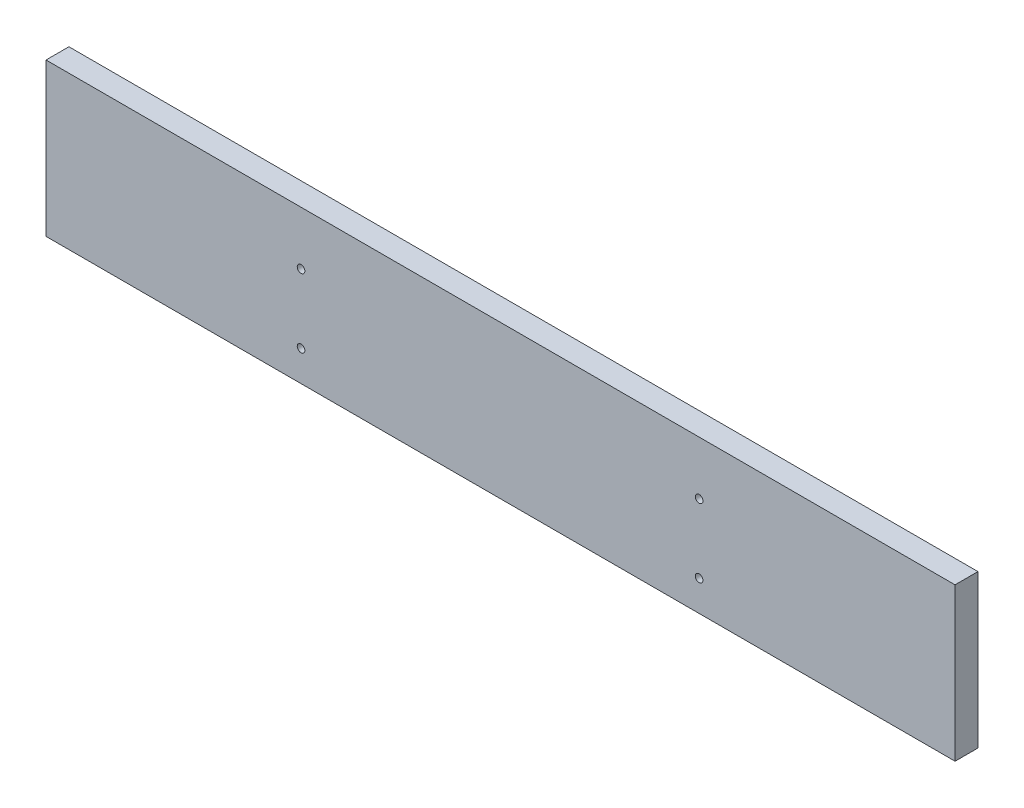
ISO-10303-21;
HEADER;
FILE_DESCRIPTION(('STEP AP214'),'2;1');
FILE_NAME('part.step','',(''),(''),'','','');
FILE_SCHEMA(('AUTOMOTIVE_DESIGN { 1 0 10303 214 1 1 1 1 }'));
ENDSEC;
DATA;
#1=APPLICATION_CONTEXT('core data for automotive mechanical design processes');
#2=APPLICATION_PROTOCOL_DEFINITION('international standard','automotive_design',2000,#1);
#3=PRODUCT_CONTEXT('',#1,'mechanical');
#4=PRODUCT('Part','Part','',(#3));
#5=PRODUCT_RELATED_PRODUCT_CATEGORY('part','',(#4));
#6=PRODUCT_DEFINITION_FORMATION('','',#4);
#7=PRODUCT_DEFINITION_CONTEXT('part definition',#1,'design');
#8=PRODUCT_DEFINITION('design','',#6,#7);
#9=PRODUCT_DEFINITION_SHAPE('','',#8);
#10=(LENGTH_UNIT() NAMED_UNIT(*) SI_UNIT(.MILLI.,.METRE.));
#11=(NAMED_UNIT(*) PLANE_ANGLE_UNIT() SI_UNIT($,.RADIAN.));
#12=(NAMED_UNIT(*) SI_UNIT($,.STERADIAN.) SOLID_ANGLE_UNIT());
#13=UNCERTAINTY_MEASURE_WITH_UNIT(LENGTH_MEASURE(1.E-05),#10,'distance_accuracy_value','');
#14=(GEOMETRIC_REPRESENTATION_CONTEXT(3) GLOBAL_UNCERTAINTY_ASSIGNED_CONTEXT((#13)) GLOBAL_UNIT_ASSIGNED_CONTEXT((#10,
#11,#12)) REPRESENTATION_CONTEXT('',''));
#15=CARTESIAN_POINT('',(0.,0.,0.));
#16=DIRECTION('',(0.,0.,1.));
#17=DIRECTION('',(1.,0.,0.));
#18=AXIS2_PLACEMENT_3D('',#15,#16,#17);
#19=CARTESIAN_POINT('',(-364.152246472205,37.4833628767301,-329.132458287191));
#20=DIRECTION('',(0.,1.,0.));
#21=DIRECTION('',(-1.,0.,0.));
#22=AXIS2_PLACEMENT_3D('',#19,#20,#21);
#23=PLANE('',#22);
#24=DIRECTION('',(1.,0.,0.));
#25=VECTOR('',#24,1.);
#26=CARTESIAN_POINT('',(-364.152246472205,37.4833628767301,-348.182458287191));
#27=LINE('',#26,#25);
#28=CARTESIAN_POINT('',(-364.152246472205,37.4833628767301,-348.182458287191));
#29=VERTEX_POINT('',#28);
#30=CARTESIAN_POINT('',(391.538596905076,37.48336287673,-348.182458287191));
#31=VERTEX_POINT('',#30);
#32=EDGE_CURVE('E101',#29,#31,#27,.T.);
#33=ORIENTED_EDGE('',*,*,#32,.T.);
#34=DIRECTION('',(0.,0.,-1.));
#35=VECTOR('',#34,1.);
#36=CARTESIAN_POINT('',(391.538596905076,37.48336287673,-329.132458287191));
#37=LINE('',#36,#35);
#38=CARTESIAN_POINT('',(391.538596905076,37.48336287673,-329.132458287191));
#39=VERTEX_POINT('',#38);
#40=EDGE_CURVE('E11',#39,#31,#37,.T.);
#41=ORIENTED_EDGE('',*,*,#40,.F.);
#42=DIRECTION('',(1.,0.,0.));
#43=VECTOR('',#42,1.);
#44=CARTESIAN_POINT('',(-364.152246472205,37.4833628767301,-329.132458287191));
#45=LINE('',#44,#43);
#46=CARTESIAN_POINT('',(-364.152246472205,37.4833628767301,-329.132458287191));
#47=VERTEX_POINT('',#46);
#48=EDGE_CURVE('E79',#47,#39,#45,.T.);
#49=ORIENTED_EDGE('',*,*,#48,.F.);
#50=DIRECTION('',(0.,0.,-1.));
#51=VECTOR('',#50,1.);
#52=CARTESIAN_POINT('',(-364.152246472205,37.4833628767301,-329.132458287191));
#53=LINE('',#52,#51);
#54=EDGE_CURVE('E100',#47,#29,#53,.T.);
#55=ORIENTED_EDGE('',*,*,#54,.T.);
#56=EDGE_LOOP('',(#33,#41,#49,#55));
#57=FACE_BOUND('',#56,.T.);
#58=ADVANCED_FACE('F37',(#57),#23,.F.);
#59=CARTESIAN_POINT('',(391.497753527795,164.48336287673,-329.132458287191));
#60=DIRECTION('',(0.999999948286275,0.000321601379283903,0.));
#61=DIRECTION('',(-0.000321601379283903,0.999999948286275,0.));
#62=AXIS2_PLACEMENT_3D('',#59,#60,#61);
#63=PLANE('',#62);
#64=DIRECTION('',(0.000321601379283903,-0.999999948286275,0.));
#65=VECTOR('',#64,1.);
#66=CARTESIAN_POINT('',(391.497753527795,164.48336287673,-348.182458287191));
#67=LINE('',#66,#65);
#68=CARTESIAN_POINT('',(391.497753527795,164.48336287673,-348.182458287191));
#69=VERTEX_POINT('',#68);
#70=EDGE_CURVE('E89',#69,#31,#67,.T.);
#71=ORIENTED_EDGE('',*,*,#70,.F.);
#72=DIRECTION('',(0.,0.,-1.));
#73=VECTOR('',#72,1.);
#74=CARTESIAN_POINT('',(391.497753527795,164.48336287673,-329.132458287191));
#75=LINE('',#74,#73);
#76=CARTESIAN_POINT('',(391.497753527795,164.48336287673,-329.132458287191));
#77=VERTEX_POINT('',#76);
#78=EDGE_CURVE('E45',#77,#69,#75,.T.);
#79=ORIENTED_EDGE('',*,*,#78,.F.);
#80=DIRECTION('',(0.000321601379283903,-0.999999948286275,0.));
#81=VECTOR('',#80,1.);
#82=CARTESIAN_POINT('',(391.497753527795,164.48336287673,-329.132458287191));
#83=LINE('',#82,#81);
#84=EDGE_CURVE('E87',#77,#39,#83,.T.);
#85=ORIENTED_EDGE('',*,*,#84,.T.);
#86=ORIENTED_EDGE('',*,*,#40,.T.);
#87=EDGE_LOOP('',(#71,#79,#85,#86));
#88=FACE_BOUND('',#87,.T.);
#89=ADVANCED_FACE('F86',(#88),#63,.T.);
#90=CARTESIAN_POINT('',(391.497753527795,164.48336287673,-329.132458287191));
#91=DIRECTION('',(0.,-1.,0.));
#92=DIRECTION('',(1.,0.,0.));
#93=AXIS2_PLACEMENT_3D('',#90,#91,#92);
#94=PLANE('',#93);
#95=DIRECTION('',(-1.,0.,0.));
#96=VECTOR('',#95,1.);
#97=CARTESIAN_POINT('',(391.497753527795,164.48336287673,-348.182458287191));
#98=LINE('',#97,#96);
#99=CARTESIAN_POINT('',(-364.152246472205,164.48336287673,-348.182458287191));
#100=VERTEX_POINT('',#99);
#101=EDGE_CURVE('E68',#69,#100,#98,.T.);
#102=ORIENTED_EDGE('',*,*,#101,.T.);
#103=DIRECTION('',(0.,0.,-1.));
#104=VECTOR('',#103,1.);
#105=CARTESIAN_POINT('',(-364.152246472205,164.48336287673,-329.132458287191));
#106=LINE('',#105,#104);
#107=CARTESIAN_POINT('',(-364.152246472205,164.48336287673,-329.132458287191));
#108=VERTEX_POINT('',#107);
#109=EDGE_CURVE('E90',#108,#100,#106,.T.);
#110=ORIENTED_EDGE('',*,*,#109,.F.);
#111=DIRECTION('',(-1.,0.,0.));
#112=VECTOR('',#111,1.);
#113=CARTESIAN_POINT('',(391.497753527795,164.48336287673,-329.132458287191));
#114=LINE('',#113,#112);
#115=EDGE_CURVE('E91',#77,#108,#114,.T.);
#116=ORIENTED_EDGE('',*,*,#115,.F.);
#117=ORIENTED_EDGE('',*,*,#78,.T.);
#118=EDGE_LOOP('',(#102,#110,#116,#117));
#119=FACE_BOUND('',#118,.T.);
#120=ADVANCED_FACE('F92',(#119),#94,.F.);
#121=CARTESIAN_POINT('',(-364.152246472205,164.48336287673,-329.132458287191));
#122=DIRECTION('',(1.,0.,0.));
#123=DIRECTION('',(0.,0.,-1.));
#124=AXIS2_PLACEMENT_3D('',#121,#122,#123);
#125=PLANE('',#124);
#126=DIRECTION('',(0.,-1.,0.));
#127=VECTOR('',#126,1.);
#128=CARTESIAN_POINT('',(-364.152246472205,164.48336287673,-348.182458287191));
#129=LINE('',#128,#127);
#130=EDGE_CURVE('E74',#100,#29,#129,.T.);
#131=ORIENTED_EDGE('',*,*,#130,.T.);
#132=ORIENTED_EDGE('',*,*,#54,.F.);
#133=DIRECTION('',(0.,-1.,0.));
#134=VECTOR('',#133,1.);
#135=CARTESIAN_POINT('',(-364.152246472205,164.48336287673,-329.132458287191));
#136=LINE('',#135,#134);
#137=EDGE_CURVE('E53',#108,#47,#136,.T.);
#138=ORIENTED_EDGE('',*,*,#137,.F.);
#139=ORIENTED_EDGE('',*,*,#109,.T.);
#140=EDGE_LOOP('',(#131,#132,#138,#139));
#141=FACE_BOUND('',#140,.T.);
#142=ADVANCED_FACE('F109',(#141),#125,.F.);
#143=CARTESIAN_POINT('',(0.,0.,-329.132458287191));
#144=DIRECTION('',(0.,0.,-1.));
#145=DIRECTION('',(-1.,0.,0.));
#146=AXIS2_PLACEMENT_3D('',#143,#144,#145);
#147=PLANE('',#146);
#148=CARTESIAN_POINT('',(-152.139046459746,120.03336287673,-329.132458287191));
#149=DIRECTION('',(0.,0.,1.));
#150=DIRECTION('',(1.,0.,0.));
#151=AXIS2_PLACEMENT_3D('',#148,#149,#150);
#152=CIRCLE('',#151,3.17499999999998);
#153=CARTESIAN_POINT('',(-148.964046459746,120.03336287673,-329.132458287191));
#154=VERTEX_POINT('',#153);
#155=EDGE_CURVE('E154',#154,#154,#152,.T.);
#156=ORIENTED_EDGE('',*,*,#155,.F.);
#157=EDGE_LOOP('',(#156));
#158=FACE_BOUND('',#157,.T.);
#159=CARTESIAN_POINT('',(-152.139046459746,62.8833628767299,-329.132458287191));
#160=DIRECTION('',(0.,0.,1.));
#161=DIRECTION('',(1.,0.,0.));
#162=AXIS2_PLACEMENT_3D('',#159,#160,#161);
#163=CIRCLE('',#162,3.17499999999998);
#164=CARTESIAN_POINT('',(-148.964046459746,62.8833628767299,-329.132458287191));
#165=VERTEX_POINT('',#164);
#166=EDGE_CURVE('E156',#165,#165,#163,.T.);
#167=ORIENTED_EDGE('',*,*,#166,.F.);
#168=EDGE_LOOP('',(#167));
#169=FACE_BOUND('',#168,.T.);
#170=CARTESIAN_POINT('',(178.772753527794,62.8833628767299,-329.132458287191));
#171=DIRECTION('',(0.,0.,1.));
#172=DIRECTION('',(1.,0.,0.));
#173=AXIS2_PLACEMENT_3D('',#170,#171,#172);
#174=CIRCLE('',#173,3.17499999999998);
#175=CARTESIAN_POINT('',(181.947753527794,62.8833628767299,-329.132458287191));
#176=VERTEX_POINT('',#175);
#177=EDGE_CURVE('E164',#176,#176,#174,.T.);
#178=ORIENTED_EDGE('',*,*,#177,.F.);
#179=EDGE_LOOP('',(#178));
#180=FACE_BOUND('',#179,.T.);
#181=CARTESIAN_POINT('',(178.772753527794,120.03336287673,-329.132458287191));
#182=DIRECTION('',(0.,0.,1.));
#183=DIRECTION('',(1.,0.,0.));
#184=AXIS2_PLACEMENT_3D('',#181,#182,#183);
#185=CIRCLE('',#184,3.17499999999998);
#186=CARTESIAN_POINT('',(181.947753527794,120.03336287673,-329.132458287191));
#187=VERTEX_POINT('',#186);
#188=EDGE_CURVE('E170',#187,#187,#185,.T.);
#189=ORIENTED_EDGE('',*,*,#188,.F.);
#190=EDGE_LOOP('',(#189));
#191=FACE_BOUND('',#190,.T.);
#192=ORIENTED_EDGE('',*,*,#48,.T.);
#193=ORIENTED_EDGE('',*,*,#84,.F.);
#194=ORIENTED_EDGE('',*,*,#115,.T.);
#195=ORIENTED_EDGE('',*,*,#137,.T.);
#196=EDGE_LOOP('',(#192,#193,#194,#195));
#197=FACE_BOUND('',#196,.T.);
#198=ADVANCED_FACE('F94',(#158,#169,#180,#191,#197),#147,.F.);
#199=CARTESIAN_POINT('',(0.,0.,-348.182458287191));
#200=DIRECTION('',(0.,0.,-1.));
#201=DIRECTION('',(-1.,0.,0.));
#202=AXIS2_PLACEMENT_3D('',#199,#200,#201);
#203=PLANE('',#202);
#204=CARTESIAN_POINT('',(-152.139046459746,120.03336287673,-348.182458287191));
#205=DIRECTION('',(0.,0.,1.));
#206=DIRECTION('',(1.,0.,0.));
#207=AXIS2_PLACEMENT_3D('',#204,#205,#206);
#208=CIRCLE('',#207,3.17499999999998);
#209=CARTESIAN_POINT('',(-148.964046459746,120.03336287673,-348.182458287191));
#210=VERTEX_POINT('',#209);
#211=EDGE_CURVE('E151',#210,#210,#208,.T.);
#212=ORIENTED_EDGE('',*,*,#211,.T.);
#213=EDGE_LOOP('',(#212));
#214=FACE_BOUND('',#213,.T.);
#215=CARTESIAN_POINT('',(-152.139046459746,62.8833628767299,-348.182458287191));
#216=DIRECTION('',(0.,0.,1.));
#217=DIRECTION('',(1.,0.,0.));
#218=AXIS2_PLACEMENT_3D('',#215,#216,#217);
#219=CIRCLE('',#218,3.17499999999998);
#220=CARTESIAN_POINT('',(-148.964046459746,62.8833628767299,-348.182458287191));
#221=VERTEX_POINT('',#220);
#222=EDGE_CURVE('E161',#221,#221,#219,.T.);
#223=ORIENTED_EDGE('',*,*,#222,.T.);
#224=EDGE_LOOP('',(#223));
#225=FACE_BOUND('',#224,.T.);
#226=CARTESIAN_POINT('',(178.772753527794,62.8833628767299,-348.182458287191));
#227=DIRECTION('',(0.,0.,1.));
#228=DIRECTION('',(1.,0.,0.));
#229=AXIS2_PLACEMENT_3D('',#226,#227,#228);
#230=CIRCLE('',#229,3.17499999999998);
#231=CARTESIAN_POINT('',(181.947753527794,62.8833628767299,-348.182458287191));
#232=VERTEX_POINT('',#231);
#233=EDGE_CURVE('E167',#232,#232,#230,.T.);
#234=ORIENTED_EDGE('',*,*,#233,.T.);
#235=EDGE_LOOP('',(#234));
#236=FACE_BOUND('',#235,.T.);
#237=CARTESIAN_POINT('',(178.772753527794,120.03336287673,-348.182458287191));
#238=DIRECTION('',(0.,0.,1.));
#239=DIRECTION('',(1.,0.,0.));
#240=AXIS2_PLACEMENT_3D('',#237,#238,#239);
#241=CIRCLE('',#240,3.17499999999998);
#242=CARTESIAN_POINT('',(181.947753527794,120.03336287673,-348.182458287191));
#243=VERTEX_POINT('',#242);
#244=EDGE_CURVE('E104',#243,#243,#241,.T.);
#245=ORIENTED_EDGE('',*,*,#244,.T.);
#246=EDGE_LOOP('',(#245));
#247=FACE_BOUND('',#246,.T.);
#248=ORIENTED_EDGE('',*,*,#32,.F.);
#249=ORIENTED_EDGE('',*,*,#130,.F.);
#250=ORIENTED_EDGE('',*,*,#101,.F.);
#251=ORIENTED_EDGE('',*,*,#70,.T.);
#252=EDGE_LOOP('',(#248,#249,#250,#251));
#253=FACE_BOUND('',#252,.T.);
#254=ADVANCED_FACE('F112',(#214,#225,#236,#247,#253),#203,.T.);
#255=CARTESIAN_POINT('',(178.772753527794,120.03336287673,-329.132458287191));
#256=DIRECTION('',(0.,0.,1.));
#257=DIRECTION('',(1.,0.,0.));
#258=AXIS2_PLACEMENT_3D('',#255,#256,#257);
#259=CYLINDRICAL_SURFACE('',#258,3.17499999999998);
#260=ORIENTED_EDGE('',*,*,#244,.F.);
#261=EDGE_LOOP('',(#260));
#262=FACE_BOUND('',#261,.T.);
#263=ORIENTED_EDGE('',*,*,#188,.T.);
#264=EDGE_LOOP('',(#263));
#265=FACE_BOUND('',#264,.T.);
#266=ADVANCED_FACE('F127',(#262,#265),#259,.F.);
#267=CARTESIAN_POINT('',(178.772753527794,62.8833628767299,-329.132458287191));
#268=DIRECTION('',(0.,0.,1.));
#269=DIRECTION('',(1.,0.,0.));
#270=AXIS2_PLACEMENT_3D('',#267,#268,#269);
#271=CYLINDRICAL_SURFACE('',#270,3.17499999999998);
#272=ORIENTED_EDGE('',*,*,#233,.F.);
#273=EDGE_LOOP('',(#272));
#274=FACE_BOUND('',#273,.T.);
#275=ORIENTED_EDGE('',*,*,#177,.T.);
#276=EDGE_LOOP('',(#275));
#277=FACE_BOUND('',#276,.T.);
#278=ADVANCED_FACE('F134',(#274,#277),#271,.F.);
#279=CARTESIAN_POINT('',(-152.139046459746,62.8833628767299,-329.132458287191));
#280=DIRECTION('',(0.,0.,1.));
#281=DIRECTION('',(1.,0.,0.));
#282=AXIS2_PLACEMENT_3D('',#279,#280,#281);
#283=CYLINDRICAL_SURFACE('',#282,3.17499999999998);
#284=ORIENTED_EDGE('',*,*,#222,.F.);
#285=EDGE_LOOP('',(#284));
#286=FACE_BOUND('',#285,.T.);
#287=ORIENTED_EDGE('',*,*,#166,.T.);
#288=EDGE_LOOP('',(#287));
#289=FACE_BOUND('',#288,.T.);
#290=ADVANCED_FACE('F138',(#286,#289),#283,.F.);
#291=CARTESIAN_POINT('',(-152.139046459746,120.03336287673,-329.132458287191));
#292=DIRECTION('',(0.,0.,1.));
#293=DIRECTION('',(1.,0.,0.));
#294=AXIS2_PLACEMENT_3D('',#291,#292,#293);
#295=CYLINDRICAL_SURFACE('',#294,3.17499999999998);
#296=ORIENTED_EDGE('',*,*,#211,.F.);
#297=EDGE_LOOP('',(#296));
#298=FACE_BOUND('',#297,.T.);
#299=ORIENTED_EDGE('',*,*,#155,.T.);
#300=EDGE_LOOP('',(#299));
#301=FACE_BOUND('',#300,.T.);
#302=ADVANCED_FACE('F142',(#298,#301),#295,.F.);
#303=CLOSED_SHELL('',(#58,#89,#120,#142,#198,#254,#266,#278,#290,#302));
#304=MANIFOLD_SOLID_BREP('B2',#303);
#305=ADVANCED_BREP_SHAPE_REPRESENTATION('',(#18,#304),#14);
#306=SHAPE_DEFINITION_REPRESENTATION(#9,#305);
ENDSEC;
END-ISO-10303-21;
